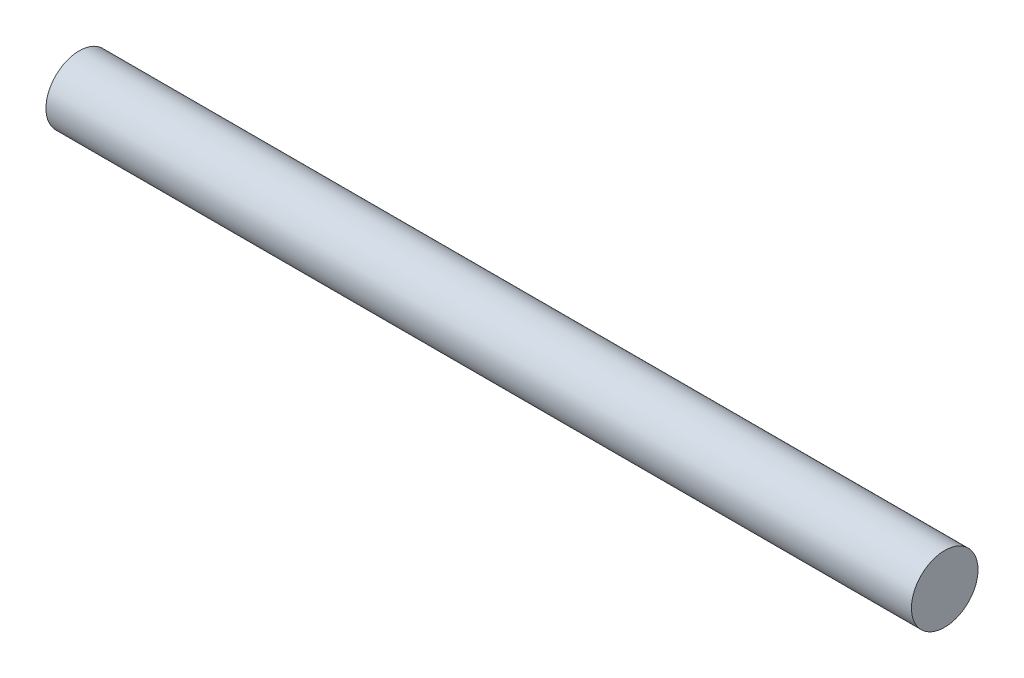
ISO-10303-21;
HEADER;
FILE_DESCRIPTION(('STEP AP214'),'2;1');
FILE_NAME('part.step','',(''),(''),'','','');
FILE_SCHEMA(('AUTOMOTIVE_DESIGN { 1 0 10303 214 1 1 1 1 }'));
ENDSEC;
DATA;
#1=APPLICATION_CONTEXT('core data for automotive mechanical design processes');
#2=APPLICATION_PROTOCOL_DEFINITION('international standard','automotive_design',2000,#1);
#3=PRODUCT_CONTEXT('',#1,'mechanical');
#4=PRODUCT('Part','Part','',(#3));
#5=PRODUCT_RELATED_PRODUCT_CATEGORY('part','',(#4));
#6=PRODUCT_DEFINITION_FORMATION('','',#4);
#7=PRODUCT_DEFINITION_CONTEXT('part definition',#1,'design');
#8=PRODUCT_DEFINITION('design','',#6,#7);
#9=PRODUCT_DEFINITION_SHAPE('','',#8);
#10=(LENGTH_UNIT() NAMED_UNIT(*) SI_UNIT(.MILLI.,.METRE.));
#11=(NAMED_UNIT(*) PLANE_ANGLE_UNIT() SI_UNIT($,.RADIAN.));
#12=(NAMED_UNIT(*) SI_UNIT($,.STERADIAN.) SOLID_ANGLE_UNIT());
#13=UNCERTAINTY_MEASURE_WITH_UNIT(LENGTH_MEASURE(1.E-05),#10,'distance_accuracy_value','');
#14=(GEOMETRIC_REPRESENTATION_CONTEXT(3) GLOBAL_UNCERTAINTY_ASSIGNED_CONTEXT((#13)) GLOBAL_UNIT_ASSIGNED_CONTEXT((#10,
#11,#12)) REPRESENTATION_CONTEXT('',''));
#15=CARTESIAN_POINT('',(0.,0.,0.));
#16=DIRECTION('',(0.,0.,1.));
#17=DIRECTION('',(1.,0.,0.));
#18=AXIS2_PLACEMENT_3D('',#15,#16,#17);
#19=CARTESIAN_POINT('',(13.,0.,0.));
#20=DIRECTION('',(-1.,0.,0.));
#21=DIRECTION('',(0.,0.,1.));
#22=AXIS2_PLACEMENT_3D('',#19,#20,#21);
#23=CYLINDRICAL_SURFACE('',#22,0.5);
#24=CARTESIAN_POINT('',(13.,0.,0.));
#25=DIRECTION('',(1.,0.,0.));
#26=DIRECTION('',(0.,0.,-1.));
#27=AXIS2_PLACEMENT_3D('',#24,#25,#26);
#28=CIRCLE('',#27,0.5);
#29=CARTESIAN_POINT('',(13.,0.,-0.5));
#30=VERTEX_POINT('',#29);
#31=EDGE_CURVE('E10',#30,#30,#28,.T.);
#32=ORIENTED_EDGE('',*,*,#31,.F.);
#33=EDGE_LOOP('',(#32));
#34=FACE_BOUND('',#33,.T.);
#35=CARTESIAN_POINT('',(0.,0.,0.));
#36=DIRECTION('',(1.,0.,0.));
#37=DIRECTION('',(0.,0.,-1.));
#38=AXIS2_PLACEMENT_3D('',#35,#36,#37);
#39=CIRCLE('',#38,0.5);
#40=CARTESIAN_POINT('',(0.,0.,-0.5));
#41=VERTEX_POINT('',#40);
#42=EDGE_CURVE('E36',#41,#41,#39,.T.);
#43=ORIENTED_EDGE('',*,*,#42,.T.);
#44=EDGE_LOOP('',(#43));
#45=FACE_BOUND('',#44,.T.);
#46=ADVANCED_FACE('F33',(#34,#45),#23,.T.);
#47=CARTESIAN_POINT('',(13.,0.,0.));
#48=DIRECTION('',(1.,0.,0.));
#49=DIRECTION('',(0.,0.,-1.));
#50=AXIS2_PLACEMENT_3D('',#47,#48,#49);
#51=PLANE('',#50);
#52=ORIENTED_EDGE('',*,*,#31,.T.);
#53=EDGE_LOOP('',(#52));
#54=FACE_BOUND('',#53,.T.);
#55=ADVANCED_FACE('F48',(#54),#51,.T.);
#56=CARTESIAN_POINT('',(0.,0.,0.));
#57=DIRECTION('',(1.,0.,0.));
#58=DIRECTION('',(0.,0.,-1.));
#59=AXIS2_PLACEMENT_3D('',#56,#57,#58);
#60=PLANE('',#59);
#61=ORIENTED_EDGE('',*,*,#42,.F.);
#62=EDGE_LOOP('',(#61));
#63=FACE_BOUND('',#62,.T.);
#64=ADVANCED_FACE('F46',(#63),#60,.F.);
#65=CLOSED_SHELL('',(#46,#55,#64));
#66=MANIFOLD_SOLID_BREP('B2',#65);
#67=ADVANCED_BREP_SHAPE_REPRESENTATION('',(#18,#66),#14);
#68=SHAPE_DEFINITION_REPRESENTATION(#9,#67);
ENDSEC;
END-ISO-10303-21;
